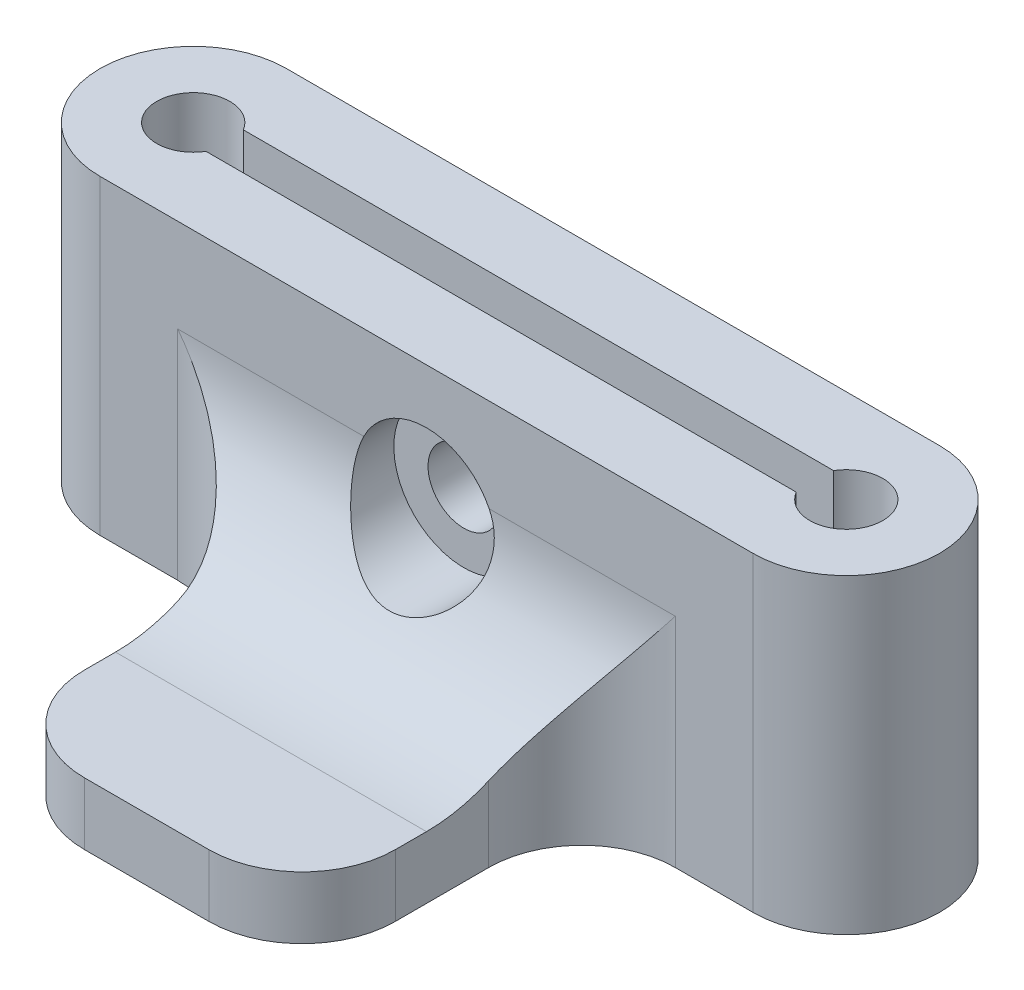
ISO-10303-21;
HEADER;
FILE_DESCRIPTION(('STEP AP214'),'2;1');
FILE_NAME('part.step','',(''),(''),'','','');
FILE_SCHEMA(('AUTOMOTIVE_DESIGN { 1 0 10303 214 1 1 1 1 }'));
ENDSEC;
DATA;
#1=APPLICATION_CONTEXT('core data for automotive mechanical design processes');
#2=APPLICATION_PROTOCOL_DEFINITION('international standard','automotive_design',2000,#1);
#3=PRODUCT_CONTEXT('',#1,'mechanical');
#4=PRODUCT('Part','Part','',(#3));
#5=PRODUCT_RELATED_PRODUCT_CATEGORY('part','',(#4));
#6=PRODUCT_DEFINITION_FORMATION('','',#4);
#7=PRODUCT_DEFINITION_CONTEXT('part definition',#1,'design');
#8=PRODUCT_DEFINITION('design','',#6,#7);
#9=PRODUCT_DEFINITION_SHAPE('','',#8);
#10=(LENGTH_UNIT() NAMED_UNIT(*) SI_UNIT(.MILLI.,.METRE.));
#11=(NAMED_UNIT(*) PLANE_ANGLE_UNIT() SI_UNIT($,.RADIAN.));
#12=(NAMED_UNIT(*) SI_UNIT($,.STERADIAN.) SOLID_ANGLE_UNIT());
#13=UNCERTAINTY_MEASURE_WITH_UNIT(LENGTH_MEASURE(1.E-05),#10,'distance_accuracy_value','');
#14=(GEOMETRIC_REPRESENTATION_CONTEXT(3) GLOBAL_UNCERTAINTY_ASSIGNED_CONTEXT((#13)) GLOBAL_UNIT_ASSIGNED_CONTEXT((#10,
#11,#12)) REPRESENTATION_CONTEXT('',''));
#15=CARTESIAN_POINT('',(0.,0.,0.));
#16=DIRECTION('',(0.,0.,1.));
#17=DIRECTION('',(1.,0.,0.));
#18=AXIS2_PLACEMENT_3D('',#15,#16,#17);
#19=CARTESIAN_POINT('',(0.,6.,-3.));
#20=DIRECTION('',(0.,0.,1.));
#21=DIRECTION('',(1.,0.,0.));
#22=AXIS2_PLACEMENT_3D('',#19,#20,#21);
#23=CYLINDRICAL_SURFACE('',#22,1.15);
#24=CARTESIAN_POINT('',(0.,6.,-0.6));
#25=DIRECTION('',(0.,0.,-1.));
#26=DIRECTION('',(-1.,0.,0.));
#27=AXIS2_PLACEMENT_3D('',#24,#25,#26);
#28=CIRCLE('',#27,1.15);
#29=CARTESIAN_POINT('',(-1.15,6.,-0.6));
#30=VERTEX_POINT('',#29);
#31=EDGE_CURVE('E263',#30,#30,#28,.T.);
#32=ORIENTED_EDGE('',*,*,#31,.F.);
#33=EDGE_LOOP('',(#32));
#34=FACE_BOUND('',#33,.T.);
#35=CARTESIAN_POINT('',(0.,6.,-1.5));
#36=DIRECTION('',(0.,0.,-1.));
#37=DIRECTION('',(-1.,0.,0.));
#38=AXIS2_PLACEMENT_3D('',#35,#36,#37);
#39=CIRCLE('',#38,1.15);
#40=CARTESIAN_POINT('',(-1.15,6.,-1.5));
#41=VERTEX_POINT('',#40);
#42=EDGE_CURVE('E44',#41,#41,#39,.F.);
#43=ORIENTED_EDGE('',*,*,#42,.F.);
#44=EDGE_LOOP('',(#43));
#45=FACE_BOUND('',#44,.T.);
#46=ADVANCED_FACE('F39',(#34,#45),#23,.F.);
#47=CARTESIAN_POINT('',(0.,7.,8.));
#48=DIRECTION('',(1.,0.,0.));
#49=DIRECTION('',(0.,0.,-1.));
#50=AXIS2_PLACEMENT_3D('',#47,#48,#49);
#51=CYLINDRICAL_SURFACE('',#50,5.);
#52=CARTESIAN_POINT('',(-2.01556443707464,7.,3.));
#53=CARTESIAN_POINT('',(-2.04175036487948,6.94723877501467,2.99999300896593));
#54=CARTESIAN_POINT('',(-2.06585073480588,6.89344078288716,3.00083496798393));
#55=CARTESIAN_POINT('',(-2.109745996837,6.78417417126407,3.00436298875684));
#56=CARTESIAN_POINT('',(-2.1295408156261,6.72870552333859,3.00704908191073));
#57=CARTESIAN_POINT('',(-2.16464542210361,6.61664371589301,3.01440230646445));
#58=CARTESIAN_POINT('',(-2.17996638703904,6.56005374260594,3.01906442828374));
#59=CARTESIAN_POINT('',(-2.20611600501055,6.4460681434285,3.03044783021604));
#60=CARTESIAN_POINT('',(-2.21694490592385,6.38867256217325,3.03716899667303));
#61=CARTESIAN_POINT('',(-2.24264423931978,6.21582810991499,3.06051329062134));
#62=CARTESIAN_POINT('',(-2.25073044685787,6.09971140376437,3.08031784448049));
#63=CARTESIAN_POINT('',(-2.24916345106013,5.86938691802106,3.12808175614079));
#64=CARTESIAN_POINT('',(-2.23950854097209,5.75517932315762,3.15604189831789));
#65=CARTESIAN_POINT('',(-2.20330128362021,5.52966744780162,3.21961675487502));
#66=CARTESIAN_POINT('',(-2.17647802356564,5.41844005746845,3.25534801669427));
#67=CARTESIAN_POINT('',(-2.10720173346062,5.20312323497078,3.3326295949892));
#68=CARTESIAN_POINT('',(-2.0647414242777,5.09903715393737,3.37418261593549));
#69=CARTESIAN_POINT('',(-1.96042439546428,4.88895331481458,3.46590946768372));
#70=CARTESIAN_POINT('',(-1.89697947371727,4.78394054653244,3.51653001272573));
#71=CARTESIAN_POINT('',(-1.75450332402742,4.58610252889114,3.61986468572548));
#72=CARTESIAN_POINT('',(-1.67545398528858,4.49329165181003,3.6725811889762));
#73=CARTESIAN_POINT('',(-1.49316365537025,4.31138982243017,3.7829004495677));
#74=CARTESIAN_POINT('',(-1.38818807487377,4.22394569484173,3.84037037042071));
#75=CARTESIAN_POINT('',(-1.16178647687953,4.06827465645595,3.94858514713366));
#76=CARTESIAN_POINT('',(-1.04038385361374,4.00002083408997,3.99933936732241));
#77=CARTESIAN_POINT('',(-0.818732140894734,3.90178255115438,4.07523449939828));
#78=CARTESIAN_POINT('',(-0.721958836539561,3.86643433798268,4.10357487065409));
#79=CARTESIAN_POINT('',(-0.522318848532056,3.80901098755309,4.15045791169847));
#80=CARTESIAN_POINT('',(-0.419461274598913,3.78691653228039,4.16901483654402));
#81=CARTESIAN_POINT('',(-0.209464273058739,3.75724988232855,4.19408703508113));
#82=CARTESIAN_POINT('',(-0.102301160703161,3.74977401624838,4.20052242427202));
#83=CARTESIAN_POINT('',(0.111969247602376,3.75023636948332,4.2001266156609));
#84=CARTESIAN_POINT('',(0.219076546107483,3.75817380707721,4.19329609067029));
#85=CARTESIAN_POINT('',(0.419590330432458,3.78736773012919,4.16864295591844));
#86=CARTESIAN_POINT('',(0.513336099698098,3.80729707031603,4.15191811710915));
#87=CARTESIAN_POINT('',(0.695858269669967,3.85820768835038,4.11024174275521));
#88=CARTESIAN_POINT('',(0.78463079545407,3.88919744912833,4.08528389391442));
#89=CARTESIAN_POINT('',(0.988138973411806,3.97455999036677,4.01871671282776));
#90=CARTESIAN_POINT('',(1.10013056457163,4.03334345609058,3.97437259876656));
#91=CARTESIAN_POINT('',(1.31091732161737,4.16707127503923,3.8791673889957));
#92=CARTESIAN_POINT('',(1.40969339748486,4.24203860643536,3.8282970693531));
#93=CARTESIAN_POINT('',(1.59427449664379,4.40741229380983,3.72352999409671));
#94=CARTESIAN_POINT('',(1.6798884743269,4.49801163912922,3.66960187211222));
#95=CARTESIAN_POINT('',(1.83532446629782,4.69249054414813,3.56291669066662));
#96=CARTESIAN_POINT('',(1.90514521906432,4.79637116368432,3.51015972505774));
#97=CARTESIAN_POINT('',(2.03341840310747,5.026963492781,3.40382861484484));
#98=CARTESIAN_POINT('',(2.09003243538265,5.1549197757315,3.35070161330166));
#99=CARTESIAN_POINT('',(2.17907744769574,5.42216037360604,3.25336204092652));
#100=CARTESIAN_POINT('',(2.21153056570779,5.56143418845957,3.2091413366759));
#101=CARTESIAN_POINT('',(2.24752413279597,5.83273526087939,3.13633360891));
#102=CARTESIAN_POINT('',(2.25359688946893,5.96412568215009,3.10663593014865));
#103=CARTESIAN_POINT('',(2.24230342081865,6.22791725385726,3.05815734328309));
#104=CARTESIAN_POINT('',(2.22495825661386,6.36031738975738,3.03936664760894));
#105=CARTESIAN_POINT('',(2.17625214454224,6.57840887217922,3.017018696461));
#106=CARTESIAN_POINT('',(2.15128327737051,6.66528823235687,3.01049475971174));
#107=CARTESIAN_POINT('',(2.09104857705997,6.83558498201691,3.00196938924199));
#108=CARTESIAN_POINT('',(2.05578791278093,6.91900408538639,2.99996568971695));
#109=CARTESIAN_POINT('',(2.01556443707464,7.,3.));
#110=B_SPLINE_CURVE_WITH_KNOTS('',3,(#52,#53,#54,#55,#56,#57,#58,#59,#60,#61,#62,#63,#64,#65,
#66,#67,#68,#69,#70,#71,#72,#73,#74,#75,#76,#77,#78,#79,#80,#81,#82,#83,#84,#85,#86,#87,#88,#89,
#90,#91,#92,#93,#94,#95,#96,#97,#98,#99,#100,#101,#102,#103,#104,#105,#106,#107,#108,#109),
.UNSPECIFIED.,.F.,.F.,(4,2,2,2,2,2,2,2,2,2,2,2,2,2,2,2,2,2,2,2,2,2,2,2,2,2,2,2,4),(0.,
0.176656014845354,0.353315037582458,0.529528852443758,0.705732942331843,1.05810966727465,
1.41052029375898,1.7686337707166,2.12691416262203,2.52349284280533,2.92053453534118,
3.36310295556381,3.80504760765345,4.1243800628563,4.44324593691299,4.76420597709031,
5.08514973946491,5.37581603946379,5.66670575044185,6.06665472641689,6.46717533704566,
6.8730500290664,7.27895712985139,7.7255087481676,8.17165069836637,8.57386197025033,
8.97571175065633,9.24688301158131,9.51791831554301),.UNSPECIFIED.);
#111=CARTESIAN_POINT('',(-2.01556443707464,7.,3.));
#112=VERTEX_POINT('',#111);
#113=CARTESIAN_POINT('',(2.01556443707464,7.,3.));
#114=VERTEX_POINT('',#113);
#115=EDGE_CURVE('E11',#112,#114,#110,.T.);
#116=ORIENTED_EDGE('',*,*,#115,.F.);
#117=DIRECTION('',(-1.,0.,0.));
#118=VECTOR('',#117,1.);
#119=CARTESIAN_POINT('',(8.,7.,3.));
#120=LINE('',#119,#118);
#121=CARTESIAN_POINT('',(-8.,7.,3.));
#122=VERTEX_POINT('',#121);
#123=EDGE_CURVE('E395',#122,#112,#120,.F.);
#124=ORIENTED_EDGE('',*,*,#123,.F.);
#125=CARTESIAN_POINT('',(-5.,2.41742430504416,6.));
#126=CARTESIAN_POINT('',(-4.99999007584464,2.45619433572678,5.91111111999838));
#127=CARTESIAN_POINT('',(-5.00394885534584,2.49756553159916,5.82342396283326));
#128=CARTESIAN_POINT('',(-5.01909527387802,2.58497092461,5.65122034191128));
#129=CARTESIAN_POINT('',(-5.03027108102269,2.63099738574333,5.56669892763463));
#130=CARTESIAN_POINT('',(-5.05900041117812,2.72681315065253,5.40214197951035));
#131=CARTESIAN_POINT('',(-5.07648778239047,2.77655933013035,5.32206950990217));
#132=CARTESIAN_POINT('',(-5.11717439439445,2.87977402986981,5.16583225064517));
#133=CARTESIAN_POINT('',(-5.14037657272062,2.93324445430396,5.08966949508105));
#134=CARTESIAN_POINT('',(-5.19855781113315,3.05784842466416,4.92217655542121));
#135=CARTESIAN_POINT('',(-5.23503000053934,3.12994713640746,4.83208183123254));
#136=CARTESIAN_POINT('',(-5.3148218834273,3.27855552023905,4.65875784631886));
#137=CARTESIAN_POINT('',(-5.35814656010761,3.35506837641437,4.57553364946836));
#138=CARTESIAN_POINT('',(-5.45077079658605,3.5121042298434,4.41570229294976));
#139=CARTESIAN_POINT('',(-5.50009596147953,3.59264348248163,4.3391260624048));
#140=CARTESIAN_POINT('',(-5.60362354169448,3.75677463200056,4.19295852675565));
#141=CARTESIAN_POINT('',(-5.65782452771141,3.84036563004706,4.12336518725023));
#142=CARTESIAN_POINT('',(-5.79274014298285,4.04392463557508,3.96462300080977));
#143=CARTESIAN_POINT('',(-5.87542029554435,4.1651272706597,3.87871762693229));
#144=CARTESIAN_POINT('',(-6.04705542389686,4.41143609639689,3.71971495392397));
#145=CARTESIAN_POINT('',(-6.13601288528326,4.53654382227043,3.64662276873677));
#146=CARTESIAN_POINT('',(-6.31881575359725,4.78979065819423,3.51274090730704));
#147=CARTESIAN_POINT('',(-6.41266284424727,4.91793080404362,3.45195550452723));
#148=CARTESIAN_POINT('',(-6.60404313592426,5.17643888357419,3.34228261146679));
#149=CARTESIAN_POINT('',(-6.70157575105494,5.30680646136517,3.29339323916332));
#150=CARTESIAN_POINT('',(-6.99243555246852,5.69263762108806,3.16650236970021));
#151=CARTESIAN_POINT('',(-7.18963215160328,5.95050185447785,3.10433245016192));
#152=CARTESIAN_POINT('',(-7.58839523182523,6.46860044004649,3.02142008987375));
#153=CARTESIAN_POINT('',(-7.78995197387807,6.72882888152756,3.00059336538387));
#154=CARTESIAN_POINT('',(-7.99422653603195,6.99254648939595,3.00000417362007));
#155=CARTESIAN_POINT('',(-7.99711328912766,6.99627327159152,3.00000000728194));
#156=CARTESIAN_POINT('',(-8.,7.,3.));
#157=B_SPLINE_CURVE_WITH_KNOTS('',3,(#125,#126,#127,#128,#129,#130,#131,#132,#133,#134,#135,
#136,#137,#138,#139,#140,#141,#142,#143,#144,#145,#146,#147,#148,#149,#150,#151,#152,#153,#154,
#155,#156),.UNSPECIFIED.,.F.,.F.,(4,2,2,2,2,2,2,2,2,2,2,2,2,2,2,4),(0.,0.290715926078942,
0.580956446582299,0.868239309782229,1.15567015190112,1.51818907481711,1.88097284765797,
2.24536288350869,2.60964644752272,3.11894232553603,3.62844101097633,4.13811631474606,
4.64771093234505,5.63631090330859,6.62289340018379,6.63703554133181),.UNSPECIFIED.);
#158=CARTESIAN_POINT('',(-5.,2.41742430504416,6.));
#159=VERTEX_POINT('',#158);
#160=EDGE_CURVE('E401',#159,#122,#157,.T.);
#161=ORIENTED_EDGE('',*,*,#160,.F.);
#162=CARTESIAN_POINT('',(-5.,7.,8.));
#163=DIRECTION('',(-1.,0.,0.));
#164=DIRECTION('',(0.,0.,1.));
#165=AXIS2_PLACEMENT_3D('',#162,#163,#164);
#166=CIRCLE('',#165,5.);
#167=CARTESIAN_POINT('',(-5.,2.,8.));
#168=VERTEX_POINT('',#167);
#169=EDGE_CURVE('E398',#168,#159,#166,.F.);
#170=ORIENTED_EDGE('',*,*,#169,.F.);
#171=DIRECTION('',(-1.,0.,0.));
#172=VECTOR('',#171,1.);
#173=CARTESIAN_POINT('',(-8.,2.,8.));
#174=LINE('',#173,#172);
#175=CARTESIAN_POINT('',(5.,2.,8.));
#176=VERTEX_POINT('',#175);
#177=EDGE_CURVE('E391',#176,#168,#174,.T.);
#178=ORIENTED_EDGE('',*,*,#177,.F.);
#179=CARTESIAN_POINT('',(5.,7.,8.));
#180=DIRECTION('',(1.,0.,0.));
#181=DIRECTION('',(0.,0.,-1.));
#182=AXIS2_PLACEMENT_3D('',#179,#180,#181);
#183=CIRCLE('',#182,5.);
#184=CARTESIAN_POINT('',(5.,2.41742430504416,6.));
#185=VERTEX_POINT('',#184);
#186=EDGE_CURVE('E49',#185,#176,#183,.F.);
#187=ORIENTED_EDGE('',*,*,#186,.F.);
#188=CARTESIAN_POINT('',(5.,2.41742430504416,6.));
#189=CARTESIAN_POINT('',(4.99999007584464,2.45619433572678,5.91111111999838));
#190=CARTESIAN_POINT('',(5.00394885534584,2.49756553159916,5.82342396283326));
#191=CARTESIAN_POINT('',(5.01909527387802,2.58497092461,5.65122034191128));
#192=CARTESIAN_POINT('',(5.03027108102269,2.63099738574334,5.56669892763463));
#193=CARTESIAN_POINT('',(5.05900041117812,2.72681315065253,5.40214197951034));
#194=CARTESIAN_POINT('',(5.07648778239047,2.77655933013035,5.32206950990216));
#195=CARTESIAN_POINT('',(5.11717439439445,2.87977402986981,5.16583225064517));
#196=CARTESIAN_POINT('',(5.14037657272062,2.93324445430396,5.08966949508105));
#197=CARTESIAN_POINT('',(5.19855781113315,3.05784842466416,4.92217655542121));
#198=CARTESIAN_POINT('',(5.23503000053933,3.12994713640746,4.83208183123254));
#199=CARTESIAN_POINT('',(5.3148218834273,3.27855552023905,4.65875784631886));
#200=CARTESIAN_POINT('',(5.35814656010761,3.35506837641436,4.57553364946836));
#201=CARTESIAN_POINT('',(5.45077079658604,3.5121042298434,4.41570229294976));
#202=CARTESIAN_POINT('',(5.50009596147953,3.59264348248163,4.3391260624048));
#203=CARTESIAN_POINT('',(5.60362354169447,3.75677463200057,4.19295852675565));
#204=CARTESIAN_POINT('',(5.65782452771141,3.84036563004706,4.12336518725023));
#205=CARTESIAN_POINT('',(5.79274014298285,4.04392463557509,3.96462300080977));
#206=CARTESIAN_POINT('',(5.87542029554435,4.1651272706597,3.87871762693229));
#207=CARTESIAN_POINT('',(6.04705542389686,4.4114360963969,3.71971495392396));
#208=CARTESIAN_POINT('',(6.13601288528326,4.53654382227044,3.64662276873677));
#209=CARTESIAN_POINT('',(6.31881575359725,4.78979065819424,3.51274090730704));
#210=CARTESIAN_POINT('',(6.41266284424727,4.91793080404363,3.45195550452723));
#211=CARTESIAN_POINT('',(6.60404313592427,5.17643888357419,3.34228261146679));
#212=CARTESIAN_POINT('',(6.70157575105496,5.30680646136516,3.29339323916331));
#213=CARTESIAN_POINT('',(6.99243555246849,5.69263762108809,3.16650236970021));
#214=CARTESIAN_POINT('',(7.18963215160311,5.95050185447798,3.10433245016192));
#215=CARTESIAN_POINT('',(7.58839523182539,6.46860044004637,3.02142008987375));
#216=CARTESIAN_POINT('',(7.78995197387871,6.72882888152706,3.00059336538387));
#217=CARTESIAN_POINT('',(7.99422653603197,6.99254648939593,3.00000417362007));
#218=CARTESIAN_POINT('',(7.99711328912767,6.99627327159151,3.00000000728194));
#219=CARTESIAN_POINT('',(8.,7.,3.));
#220=B_SPLINE_CURVE_WITH_KNOTS('',3,(#188,#189,#190,#191,#192,#193,#194,#195,#196,#197,#198,
#199,#200,#201,#202,#203,#204,#205,#206,#207,#208,#209,#210,#211,#212,#213,#214,#215,#216,#217,
#218,#219),.UNSPECIFIED.,.F.,.F.,(4,2,2,2,2,2,2,2,2,2,2,2,2,2,2,4),(0.,0.290715926078945,
0.580956446582304,0.868239309782232,1.15567015190112,1.51818907481711,1.88097284765797,
2.24536288350869,2.60964644752272,3.11894232553604,3.62844101097634,4.13811631474607,
4.64771093234505,5.63631090330859,6.62289340018379,6.63703554133181),.UNSPECIFIED.);
#221=CARTESIAN_POINT('',(8.,7.,3.));
#222=VERTEX_POINT('',#221);
#223=EDGE_CURVE('E408',#222,#185,#220,.F.);
#224=ORIENTED_EDGE('',*,*,#223,.F.);
#225=EDGE_CURVE('E394',#114,#222,#120,.F.);
#226=ORIENTED_EDGE('',*,*,#225,.F.);
#227=EDGE_LOOP('',(#116,#124,#161,#170,#178,#187,#224,#226));
#228=FACE_BOUND('',#227,.T.);
#229=ADVANCED_FACE('F41',(#228),#51,.F.);
#230=CARTESIAN_POINT('',(-10.5,10.,0.));
#231=DIRECTION('',(0.,1.,0.));
#232=DIRECTION('',(0.,0.,1.));
#233=AXIS2_PLACEMENT_3D('',#230,#231,#232);
#234=PLANE('',#233);
#235=DIRECTION('',(1.,0.,0.));
#236=VECTOR('',#235,1.);
#237=CARTESIAN_POINT('',(-9.48974013244117,10.,-0.6));
#238=LINE('',#237,#236);
#239=CARTESIAN_POINT('',(-9.48974013244117,10.,-0.600000000000008));
#240=VERTEX_POINT('',#239);
#241=CARTESIAN_POINT('',(9.48974013244116,10.,-0.6));
#242=VERTEX_POINT('',#241);
#243=EDGE_CURVE('E275',#240,#242,#238,.T.);
#244=ORIENTED_EDGE('',*,*,#243,.T.);
#245=CARTESIAN_POINT('',(10.5,10.,0.));
#246=DIRECTION('',(0.,1.,0.));
#247=DIRECTION('',(0.,0.,1.));
#248=AXIS2_PLACEMENT_3D('',#245,#246,#247);
#249=CIRCLE('',#248,1.175);
#250=CARTESIAN_POINT('',(9.48974013244116,10.,0.6));
#251=VERTEX_POINT('',#250);
#252=EDGE_CURVE('E318',#251,#242,#249,.T.);
#253=ORIENTED_EDGE('',*,*,#252,.F.);
#254=DIRECTION('',(-1.,0.,0.));
#255=VECTOR('',#254,1.);
#256=CARTESIAN_POINT('',(-9.48974013244117,10.,0.6));
#257=LINE('',#256,#255);
#258=CARTESIAN_POINT('',(-9.48974013244117,10.,0.6));
#259=VERTEX_POINT('',#258);
#260=EDGE_CURVE('E272',#251,#259,#257,.T.);
#261=ORIENTED_EDGE('',*,*,#260,.T.);
#262=CARTESIAN_POINT('',(-10.5,10.,0.));
#263=DIRECTION('',(0.,1.,0.));
#264=DIRECTION('',(0.,0.,-1.));
#265=AXIS2_PLACEMENT_3D('',#262,#263,#264);
#266=CIRCLE('',#265,1.175);
#267=EDGE_CURVE('E312',#240,#259,#266,.T.);
#268=ORIENTED_EDGE('',*,*,#267,.F.);
#269=EDGE_LOOP('',(#244,#253,#261,#268));
#270=FACE_BOUND('',#269,.T.);
#271=CARTESIAN_POINT('',(-10.5,10.,0.));
#272=DIRECTION('',(0.,1.,0.));
#273=DIRECTION('',(0.,0.,1.));
#274=AXIS2_PLACEMENT_3D('',#271,#272,#273);
#275=CIRCLE('',#274,3.);
#276=CARTESIAN_POINT('',(-10.5,10.,-3.));
#277=VERTEX_POINT('',#276);
#278=CARTESIAN_POINT('',(-10.5,10.,3.));
#279=VERTEX_POINT('',#278);
#280=EDGE_CURVE('E324',#277,#279,#275,.T.);
#281=ORIENTED_EDGE('',*,*,#280,.T.);
#282=DIRECTION('',(1.,0.,0.));
#283=VECTOR('',#282,1.);
#284=CARTESIAN_POINT('',(-10.5,10.,3.));
#285=LINE('',#284,#283);
#286=CARTESIAN_POINT('',(10.5,10.,3.));
#287=VERTEX_POINT('',#286);
#288=EDGE_CURVE('E327',#279,#287,#285,.T.);
#289=ORIENTED_EDGE('',*,*,#288,.T.);
#290=CARTESIAN_POINT('',(10.5,10.,0.));
#291=DIRECTION('',(0.,1.,0.));
#292=DIRECTION('',(0.,0.,1.));
#293=AXIS2_PLACEMENT_3D('',#290,#291,#292);
#294=CIRCLE('',#293,3.);
#295=CARTESIAN_POINT('',(10.5,10.,-3.));
#296=VERTEX_POINT('',#295);
#297=EDGE_CURVE('E330',#287,#296,#294,.T.);
#298=ORIENTED_EDGE('',*,*,#297,.T.);
#299=DIRECTION('',(-1.,0.,0.));
#300=VECTOR('',#299,1.);
#301=CARTESIAN_POINT('',(-10.5,10.,-3.));
#302=LINE('',#301,#300);
#303=EDGE_CURVE('E332',#296,#277,#302,.T.);
#304=ORIENTED_EDGE('',*,*,#303,.T.);
#305=EDGE_LOOP('',(#281,#289,#298,#304));
#306=FACE_BOUND('',#305,.T.);
#307=ADVANCED_FACE('F454',(#270,#306),#234,.T.);
#308=CARTESIAN_POINT('',(-10.5,0.,0.));
#309=DIRECTION('',(0.,1.,0.));
#310=DIRECTION('',(0.,0.,1.));
#311=AXIS2_PLACEMENT_3D('',#308,#309,#310);
#312=PLANE('',#311);
#313=DIRECTION('',(-1.,0.,0.));
#314=VECTOR('',#313,1.);
#315=CARTESIAN_POINT('',(-5.,0.,12.));
#316=LINE('',#315,#314);
#317=CARTESIAN_POINT('',(2.,0.,12.));
#318=VERTEX_POINT('',#317);
#319=CARTESIAN_POINT('',(-2.,0.,12.));
#320=VERTEX_POINT('',#319);
#321=EDGE_CURVE('E305',#318,#320,#316,.T.);
#322=ORIENTED_EDGE('',*,*,#321,.T.);
#323=CARTESIAN_POINT('',(-2.,0.,9.));
#324=DIRECTION('',(0.,1.,0.));
#325=DIRECTION('',(0.,0.,1.));
#326=AXIS2_PLACEMENT_3D('',#323,#324,#325);
#327=CIRCLE('',#326,3.);
#328=CARTESIAN_POINT('',(-5.,0.,9.));
#329=VERTEX_POINT('',#328);
#330=EDGE_CURVE('E363',#320,#329,#327,.F.);
#331=ORIENTED_EDGE('',*,*,#330,.T.);
#332=DIRECTION('',(0.,0.,-1.));
#333=VECTOR('',#332,1.);
#334=CARTESIAN_POINT('',(-5.,0.,12.));
#335=LINE('',#334,#333);
#336=CARTESIAN_POINT('',(-5.,0.,6.));
#337=VERTEX_POINT('',#336);
#338=EDGE_CURVE('E295',#329,#337,#335,.T.);
#339=ORIENTED_EDGE('',*,*,#338,.T.);
#340=CARTESIAN_POINT('',(-8.,0.,6.));
#341=DIRECTION('',(0.,1.,0.));
#342=DIRECTION('',(0.,0.,1.));
#343=AXIS2_PLACEMENT_3D('',#340,#341,#342);
#344=CIRCLE('',#343,3.);
#345=CARTESIAN_POINT('',(-8.,0.,3.));
#346=VERTEX_POINT('',#345);
#347=EDGE_CURVE('E389',#337,#346,#344,.T.);
#348=ORIENTED_EDGE('',*,*,#347,.T.);
#349=DIRECTION('',(1.,0.,0.));
#350=VECTOR('',#349,1.);
#351=CARTESIAN_POINT('',(-10.5,0.,3.));
#352=LINE('',#351,#350);
#353=CARTESIAN_POINT('',(-10.5,0.,3.));
#354=VERTEX_POINT('',#353);
#355=EDGE_CURVE('E338',#354,#346,#352,.T.);
#356=ORIENTED_EDGE('',*,*,#355,.F.);
#357=CARTESIAN_POINT('',(-10.5,0.,0.));
#358=DIRECTION('',(0.,1.,0.));
#359=DIRECTION('',(0.,0.,1.));
#360=AXIS2_PLACEMENT_3D('',#357,#358,#359);
#361=CIRCLE('',#360,3.);
#362=CARTESIAN_POINT('',(-10.5,0.,-3.));
#363=VERTEX_POINT('',#362);
#364=EDGE_CURVE('E321',#363,#354,#361,.T.);
#365=ORIENTED_EDGE('',*,*,#364,.F.);
#366=DIRECTION('',(-1.,0.,0.));
#367=VECTOR('',#366,1.);
#368=CARTESIAN_POINT('',(-10.5,0.,-3.));
#369=LINE('',#368,#367);
#370=CARTESIAN_POINT('',(10.5,0.,-3.));
#371=VERTEX_POINT('',#370);
#372=EDGE_CURVE('E328',#371,#363,#369,.T.);
#373=ORIENTED_EDGE('',*,*,#372,.F.);
#374=CARTESIAN_POINT('',(10.5,0.,0.));
#375=DIRECTION('',(0.,1.,0.));
#376=DIRECTION('',(0.,0.,1.));
#377=AXIS2_PLACEMENT_3D('',#374,#375,#376);
#378=CIRCLE('',#377,3.);
#379=CARTESIAN_POINT('',(10.5,0.,3.));
#380=VERTEX_POINT('',#379);
#381=EDGE_CURVE('E341',#380,#371,#378,.T.);
#382=ORIENTED_EDGE('',*,*,#381,.F.);
#383=CARTESIAN_POINT('',(7.99999999999999,0.,3.));
#384=VERTEX_POINT('',#383);
#385=EDGE_CURVE('E337',#384,#380,#352,.T.);
#386=ORIENTED_EDGE('',*,*,#385,.F.);
#387=CARTESIAN_POINT('',(8.,0.,6.));
#388=DIRECTION('',(0.,1.,0.));
#389=DIRECTION('',(0.,0.,1.));
#390=AXIS2_PLACEMENT_3D('',#387,#388,#389);
#391=CIRCLE('',#390,3.);
#392=CARTESIAN_POINT('',(5.,0.,6.));
#393=VERTEX_POINT('',#392);
#394=EDGE_CURVE('E387',#384,#393,#391,.T.);
#395=ORIENTED_EDGE('',*,*,#394,.T.);
#396=DIRECTION('',(0.,0.,1.));
#397=VECTOR('',#396,1.);
#398=CARTESIAN_POINT('',(5.,0.,12.));
#399=LINE('',#398,#397);
#400=CARTESIAN_POINT('',(5.,0.,9.));
#401=VERTEX_POINT('',#400);
#402=EDGE_CURVE('E285',#393,#401,#399,.T.);
#403=ORIENTED_EDGE('',*,*,#402,.T.);
#404=CARTESIAN_POINT('',(2.,0.,9.));
#405=DIRECTION('',(0.,1.,0.));
#406=DIRECTION('',(0.,0.,1.));
#407=AXIS2_PLACEMENT_3D('',#404,#405,#406);
#408=CIRCLE('',#407,3.);
#409=EDGE_CURVE('E361',#401,#318,#408,.F.);
#410=ORIENTED_EDGE('',*,*,#409,.T.);
#411=EDGE_LOOP('',(#322,#331,#339,#348,#356,#365,#373,#382,#386,#395,#403,#410));
#412=FACE_BOUND('',#411,.T.);
#413=CARTESIAN_POINT('',(10.5,0.,0.));
#414=DIRECTION('',(0.,1.,0.));
#415=DIRECTION('',(0.,0.,1.));
#416=AXIS2_PLACEMENT_3D('',#413,#414,#415);
#417=CIRCLE('',#416,1.175);
#418=CARTESIAN_POINT('',(9.48974013244116,0.,0.6));
#419=VERTEX_POINT('',#418);
#420=CARTESIAN_POINT('',(9.48974013244116,0.,-0.6));
#421=VERTEX_POINT('',#420);
#422=EDGE_CURVE('E315',#419,#421,#417,.T.);
#423=ORIENTED_EDGE('',*,*,#422,.T.);
#424=DIRECTION('',(1.,0.,0.));
#425=VECTOR('',#424,1.);
#426=CARTESIAN_POINT('',(-9.48974013244117,0.,-0.6));
#427=LINE('',#426,#425);
#428=CARTESIAN_POINT('',(-9.48974013244117,0.,-0.6));
#429=VERTEX_POINT('',#428);
#430=EDGE_CURVE('E276',#429,#421,#427,.T.);
#431=ORIENTED_EDGE('',*,*,#430,.F.);
#432=CARTESIAN_POINT('',(-10.5,0.,0.));
#433=DIRECTION('',(0.,1.,0.));
#434=DIRECTION('',(0.,0.,-1.));
#435=AXIS2_PLACEMENT_3D('',#432,#433,#434);
#436=CIRCLE('',#435,1.175);
#437=CARTESIAN_POINT('',(-9.48974013244117,0.,0.600000000000008));
#438=VERTEX_POINT('',#437);
#439=EDGE_CURVE('E302',#429,#438,#436,.T.);
#440=ORIENTED_EDGE('',*,*,#439,.T.);
#441=DIRECTION('',(-1.,0.,0.));
#442=VECTOR('',#441,1.);
#443=CARTESIAN_POINT('',(-9.48974013244117,0.,0.6));
#444=LINE('',#443,#442);
#445=EDGE_CURVE('E271',#419,#438,#444,.T.);
#446=ORIENTED_EDGE('',*,*,#445,.F.);
#447=EDGE_LOOP('',(#423,#431,#440,#446));
#448=FACE_BOUND('',#447,.T.);
#449=ADVANCED_FACE('F438',(#412,#448),#312,.F.);
#450=CARTESIAN_POINT('',(-10.5,10.,0.));
#451=DIRECTION('',(0.,-1.,0.));
#452=DIRECTION('',(0.,0.,-1.));
#453=AXIS2_PLACEMENT_3D('',#450,#451,#452);
#454=CYLINDRICAL_SURFACE('',#453,3.);
#455=ORIENTED_EDGE('',*,*,#364,.T.);
#456=DIRECTION('',(0.,-1.,0.));
#457=VECTOR('',#456,1.);
#458=CARTESIAN_POINT('',(-10.5,10.,3.));
#459=LINE('',#458,#457);
#460=EDGE_CURVE('E352',#279,#354,#459,.T.);
#461=ORIENTED_EDGE('',*,*,#460,.F.);
#462=ORIENTED_EDGE('',*,*,#280,.F.);
#463=DIRECTION('',(0.,-1.,0.));
#464=VECTOR('',#463,1.);
#465=CARTESIAN_POINT('',(-10.5,10.,-3.));
#466=LINE('',#465,#464);
#467=EDGE_CURVE('E334',#277,#363,#466,.T.);
#468=ORIENTED_EDGE('',*,*,#467,.T.);
#469=EDGE_LOOP('',(#455,#461,#462,#468));
#470=FACE_BOUND('',#469,.T.);
#471=ADVANCED_FACE('F434',(#470),#454,.T.);
#472=CARTESIAN_POINT('',(-10.5,10.,3.));
#473=DIRECTION('',(0.,0.,-1.));
#474=DIRECTION('',(-1.,0.,0.));
#475=AXIS2_PLACEMENT_3D('',#472,#473,#474);
#476=PLANE('',#475);
#477=CARTESIAN_POINT('',(0.,6.,3.));
#478=DIRECTION('',(0.,0.,-1.));
#479=DIRECTION('',(-1.,0.,0.));
#480=AXIS2_PLACEMENT_3D('',#477,#478,#479);
#481=CIRCLE('',#480,2.25);
#482=EDGE_CURVE('E63',#114,#112,#481,.F.);
#483=ORIENTED_EDGE('',*,*,#482,.F.);
#484=ORIENTED_EDGE('',*,*,#225,.T.);
#485=DIRECTION('',(0.,-1.,0.));
#486=VECTOR('',#485,1.);
#487=CARTESIAN_POINT('',(8.,10.,3.));
#488=LINE('',#487,#486);
#489=EDGE_CURVE('E384',#222,#384,#488,.T.);
#490=ORIENTED_EDGE('',*,*,#489,.T.);
#491=ORIENTED_EDGE('',*,*,#385,.T.);
#492=DIRECTION('',(0.,-1.,0.));
#493=VECTOR('',#492,1.);
#494=CARTESIAN_POINT('',(10.5,10.,3.));
#495=LINE('',#494,#493);
#496=EDGE_CURVE('E349',#287,#380,#495,.T.);
#497=ORIENTED_EDGE('',*,*,#496,.F.);
#498=ORIENTED_EDGE('',*,*,#288,.F.);
#499=ORIENTED_EDGE('',*,*,#460,.T.);
#500=ORIENTED_EDGE('',*,*,#355,.T.);
#501=DIRECTION('',(0.,1.,0.));
#502=VECTOR('',#501,1.);
#503=CARTESIAN_POINT('',(-8.,10.,3.));
#504=LINE('',#503,#502);
#505=EDGE_CURVE('E382',#346,#122,#504,.T.);
#506=ORIENTED_EDGE('',*,*,#505,.T.);
#507=ORIENTED_EDGE('',*,*,#123,.T.);
#508=EDGE_LOOP('',(#483,#484,#490,#491,#497,#498,#499,#500,#506,#507));
#509=FACE_BOUND('',#508,.T.);
#510=ADVANCED_FACE('F437',(#509),#476,.F.);
#511=CARTESIAN_POINT('',(10.5,10.,0.));
#512=DIRECTION('',(0.,-1.,0.));
#513=DIRECTION('',(0.,0.,-1.));
#514=AXIS2_PLACEMENT_3D('',#511,#512,#513);
#515=CYLINDRICAL_SURFACE('',#514,3.);
#516=ORIENTED_EDGE('',*,*,#381,.T.);
#517=DIRECTION('',(0.,-1.,0.));
#518=VECTOR('',#517,1.);
#519=CARTESIAN_POINT('',(10.5,10.,-3.));
#520=LINE('',#519,#518);
#521=EDGE_CURVE('E346',#296,#371,#520,.T.);
#522=ORIENTED_EDGE('',*,*,#521,.F.);
#523=ORIENTED_EDGE('',*,*,#297,.F.);
#524=ORIENTED_EDGE('',*,*,#496,.T.);
#525=EDGE_LOOP('',(#516,#522,#523,#524));
#526=FACE_BOUND('',#525,.T.);
#527=ADVANCED_FACE('F442',(#526),#515,.T.);
#528=CARTESIAN_POINT('',(-10.5,10.,-3.));
#529=DIRECTION('',(0.,0.,1.));
#530=DIRECTION('',(1.,0.,0.));
#531=AXIS2_PLACEMENT_3D('',#528,#529,#530);
#532=PLANE('',#531);
#533=DIRECTION('',(0.866025403784438,-0.5,0.));
#534=VECTOR('',#533,1.);
#535=CARTESIAN_POINT('',(0.,8.42487113059643,-3.));
#536=LINE('',#535,#534);
#537=CARTESIAN_POINT('',(0.,8.42487113059643,-3.));
#538=VERTEX_POINT('',#537);
#539=CARTESIAN_POINT('',(2.1,7.21243556529821,-3.));
#540=VERTEX_POINT('',#539);
#541=EDGE_CURVE('E241',#538,#540,#536,.T.);
#542=ORIENTED_EDGE('',*,*,#541,.F.);
#543=DIRECTION('',(0.866025403784439,0.499999999999999,0.));
#544=VECTOR('',#543,1.);
#545=CARTESIAN_POINT('',(-2.1,7.21243556529822,-3.));
#546=LINE('',#545,#544);
#547=CARTESIAN_POINT('',(-2.1,7.21243556529822,-3.));
#548=VERTEX_POINT('',#547);
#549=EDGE_CURVE('E57',#548,#538,#546,.T.);
#550=ORIENTED_EDGE('',*,*,#549,.F.);
#551=DIRECTION('',(0.,1.,0.));
#552=VECTOR('',#551,1.);
#553=CARTESIAN_POINT('',(-2.1,4.78756443470179,-3.));
#554=LINE('',#553,#552);
#555=CARTESIAN_POINT('',(-2.1,4.78756443470179,-3.));
#556=VERTEX_POINT('',#555);
#557=EDGE_CURVE('E227',#556,#548,#554,.T.);
#558=ORIENTED_EDGE('',*,*,#557,.F.);
#559=DIRECTION('',(-0.866025403784438,0.5,0.));
#560=VECTOR('',#559,1.);
#561=CARTESIAN_POINT('',(0.,3.57512886940357,-3.));
#562=LINE('',#561,#560);
#563=CARTESIAN_POINT('',(0.,3.57512886940357,-3.));
#564=VERTEX_POINT('',#563);
#565=EDGE_CURVE('E230',#564,#556,#562,.T.);
#566=ORIENTED_EDGE('',*,*,#565,.F.);
#567=DIRECTION('',(-0.866025403784439,-0.499999999999999,0.));
#568=VECTOR('',#567,1.);
#569=CARTESIAN_POINT('',(2.1,4.78756443470178,-3.));
#570=LINE('',#569,#568);
#571=CARTESIAN_POINT('',(2.1,4.78756443470178,-3.));
#572=VERTEX_POINT('',#571);
#573=EDGE_CURVE('E246',#572,#564,#570,.T.);
#574=ORIENTED_EDGE('',*,*,#573,.F.);
#575=DIRECTION('',(0.,-1.,0.));
#576=VECTOR('',#575,1.);
#577=CARTESIAN_POINT('',(2.1,7.21243556529821,-3.));
#578=LINE('',#577,#576);
#579=EDGE_CURVE('E243',#540,#572,#578,.T.);
#580=ORIENTED_EDGE('',*,*,#579,.F.);
#581=EDGE_LOOP('',(#542,#550,#558,#566,#574,#580));
#582=FACE_BOUND('',#581,.T.);
#583=ORIENTED_EDGE('',*,*,#372,.T.);
#584=ORIENTED_EDGE('',*,*,#467,.F.);
#585=ORIENTED_EDGE('',*,*,#303,.F.);
#586=ORIENTED_EDGE('',*,*,#521,.T.);
#587=EDGE_LOOP('',(#583,#584,#585,#586));
#588=FACE_BOUND('',#587,.T.);
#589=ADVANCED_FACE('F446',(#582,#588),#532,.F.);
#590=CARTESIAN_POINT('',(10.5,10.,0.));
#591=DIRECTION('',(0.,-1.,0.));
#592=DIRECTION('',(0.,0.,-1.));
#593=AXIS2_PLACEMENT_3D('',#590,#591,#592);
#594=CYLINDRICAL_SURFACE('',#593,1.175);
#595=DIRECTION('',(0.,-1.,0.));
#596=VECTOR('',#595,1.);
#597=CARTESIAN_POINT('',(9.48974013244116,10.,-0.6));
#598=LINE('',#597,#596);
#599=EDGE_CURVE('E282',#242,#421,#598,.T.);
#600=ORIENTED_EDGE('',*,*,#599,.T.);
#601=ORIENTED_EDGE('',*,*,#422,.F.);
#602=DIRECTION('',(0.,-1.,0.));
#603=VECTOR('',#602,1.);
#604=CARTESIAN_POINT('',(9.48974013244116,10.,0.6));
#605=LINE('',#604,#603);
#606=EDGE_CURVE('E279',#251,#419,#605,.T.);
#607=ORIENTED_EDGE('',*,*,#606,.F.);
#608=ORIENTED_EDGE('',*,*,#252,.T.);
#609=EDGE_LOOP('',(#600,#601,#607,#608));
#610=FACE_BOUND('',#609,.T.);
#611=ADVANCED_FACE('F450',(#610),#594,.F.);
#612=CARTESIAN_POINT('',(-10.5,10.,0.));
#613=DIRECTION('',(0.,-1.,0.));
#614=DIRECTION('',(0.,0.,-1.));
#615=AXIS2_PLACEMENT_3D('',#612,#613,#614);
#616=CYLINDRICAL_SURFACE('',#615,1.175);
#617=DIRECTION('',(0.,-1.,0.));
#618=VECTOR('',#617,1.);
#619=CARTESIAN_POINT('',(-9.48974013244117,10.,-0.6));
#620=LINE('',#619,#618);
#621=EDGE_CURVE('E286',#240,#429,#620,.T.);
#622=ORIENTED_EDGE('',*,*,#621,.F.);
#623=ORIENTED_EDGE('',*,*,#267,.T.);
#624=DIRECTION('',(0.,-1.,0.));
#625=VECTOR('',#624,1.);
#626=CARTESIAN_POINT('',(-9.48974013244117,10.,0.6));
#627=LINE('',#626,#625);
#628=EDGE_CURVE('E288',#259,#438,#627,.T.);
#629=ORIENTED_EDGE('',*,*,#628,.T.);
#630=ORIENTED_EDGE('',*,*,#439,.F.);
#631=EDGE_LOOP('',(#622,#623,#629,#630));
#632=FACE_BOUND('',#631,.T.);
#633=ADVANCED_FACE('F461',(#632),#616,.F.);
#634=CARTESIAN_POINT('',(5.,2.,12.));
#635=DIRECTION('',(1.,0.,0.));
#636=DIRECTION('',(0.,0.,-1.));
#637=AXIS2_PLACEMENT_3D('',#634,#635,#636);
#638=PLANE('',#637);
#639=DIRECTION('',(0.,-1.,0.));
#640=VECTOR('',#639,1.);
#641=CARTESIAN_POINT('',(5.,2.,6.));
#642=LINE('',#641,#640);
#643=EDGE_CURVE('E377',#393,#185,#642,.F.);
#644=ORIENTED_EDGE('',*,*,#643,.T.);
#645=ORIENTED_EDGE('',*,*,#186,.T.);
#646=DIRECTION('',(0.,0.,1.));
#647=VECTOR('',#646,1.);
#648=CARTESIAN_POINT('',(5.,2.,12.));
#649=LINE('',#648,#647);
#650=CARTESIAN_POINT('',(5.,2.,9.));
#651=VERTEX_POINT('',#650);
#652=EDGE_CURVE('E292',#176,#651,#649,.T.);
#653=ORIENTED_EDGE('',*,*,#652,.T.);
#654=DIRECTION('',(0.,-1.,0.));
#655=VECTOR('',#654,1.);
#656=CARTESIAN_POINT('',(5.,2.,9.));
#657=LINE('',#656,#655);
#658=EDGE_CURVE('E379',#651,#401,#657,.T.);
#659=ORIENTED_EDGE('',*,*,#658,.T.);
#660=ORIENTED_EDGE('',*,*,#402,.F.);
#661=EDGE_LOOP('',(#644,#645,#653,#659,#660));
#662=FACE_BOUND('',#661,.T.);
#663=ADVANCED_FACE('F465',(#662),#638,.T.);
#664=CARTESIAN_POINT('',(-5.,2.,12.));
#665=DIRECTION('',(-1.,0.,0.));
#666=DIRECTION('',(0.,0.,1.));
#667=AXIS2_PLACEMENT_3D('',#664,#665,#666);
#668=PLANE('',#667);
#669=ORIENTED_EDGE('',*,*,#338,.F.);
#670=DIRECTION('',(0.,-1.,0.));
#671=VECTOR('',#670,1.);
#672=CARTESIAN_POINT('',(-5.,2.,9.));
#673=LINE('',#672,#671);
#674=CARTESIAN_POINT('',(-5.,2.,9.));
#675=VERTEX_POINT('',#674);
#676=EDGE_CURVE('E368',#329,#675,#673,.F.);
#677=ORIENTED_EDGE('',*,*,#676,.T.);
#678=DIRECTION('',(0.,0.,-1.));
#679=VECTOR('',#678,1.);
#680=CARTESIAN_POINT('',(-5.,2.,12.));
#681=LINE('',#680,#679);
#682=EDGE_CURVE('E299',#675,#168,#681,.T.);
#683=ORIENTED_EDGE('',*,*,#682,.T.);
#684=ORIENTED_EDGE('',*,*,#169,.T.);
#685=DIRECTION('',(0.,1.,0.));
#686=VECTOR('',#685,1.);
#687=CARTESIAN_POINT('',(-5.,2.,6.));
#688=LINE('',#687,#686);
#689=EDGE_CURVE('E366',#159,#337,#688,.F.);
#690=ORIENTED_EDGE('',*,*,#689,.T.);
#691=EDGE_LOOP('',(#669,#677,#683,#684,#690));
#692=FACE_BOUND('',#691,.T.);
#693=ADVANCED_FACE('F469',(#692),#668,.T.);
#694=CARTESIAN_POINT('',(0.,2.,0.));
#695=DIRECTION('',(0.,-1.,0.));
#696=DIRECTION('',(0.,0.,-1.));
#697=AXIS2_PLACEMENT_3D('',#694,#695,#696);
#698=PLANE('',#697);
#699=ORIENTED_EDGE('',*,*,#652,.F.);
#700=ORIENTED_EDGE('',*,*,#177,.T.);
#701=ORIENTED_EDGE('',*,*,#682,.F.);
#702=CARTESIAN_POINT('',(-2.,2.,9.));
#703=DIRECTION('',(0.,-1.,0.));
#704=DIRECTION('',(0.,0.,-1.));
#705=AXIS2_PLACEMENT_3D('',#702,#703,#704);
#706=CIRCLE('',#705,3.);
#707=CARTESIAN_POINT('',(-2.,2.,12.));
#708=VERTEX_POINT('',#707);
#709=EDGE_CURVE('E374',#675,#708,#706,.F.);
#710=ORIENTED_EDGE('',*,*,#709,.T.);
#711=DIRECTION('',(-1.,0.,0.));
#712=VECTOR('',#711,1.);
#713=CARTESIAN_POINT('',(-5.,2.,12.));
#714=LINE('',#713,#712);
#715=CARTESIAN_POINT('',(2.,2.,12.));
#716=VERTEX_POINT('',#715);
#717=EDGE_CURVE('E294',#716,#708,#714,.T.);
#718=ORIENTED_EDGE('',*,*,#717,.F.);
#719=CARTESIAN_POINT('',(2.,2.,9.));
#720=DIRECTION('',(0.,-1.,0.));
#721=DIRECTION('',(0.,0.,-1.));
#722=AXIS2_PLACEMENT_3D('',#719,#720,#721);
#723=CIRCLE('',#722,3.);
#724=EDGE_CURVE('E371',#716,#651,#723,.F.);
#725=ORIENTED_EDGE('',*,*,#724,.T.);
#726=EDGE_LOOP('',(#699,#700,#701,#710,#718,#725));
#727=FACE_BOUND('',#726,.T.);
#728=ADVANCED_FACE('F473',(#727),#698,.F.);
#729=CARTESIAN_POINT('',(-5.,2.,12.));
#730=DIRECTION('',(0.,0.,1.));
#731=DIRECTION('',(1.,0.,0.));
#732=AXIS2_PLACEMENT_3D('',#729,#730,#731);
#733=PLANE('',#732);
#734=ORIENTED_EDGE('',*,*,#717,.T.);
#735=DIRECTION('',(0.,-1.,0.));
#736=VECTOR('',#735,1.);
#737=CARTESIAN_POINT('',(-2.,2.,12.));
#738=LINE('',#737,#736);
#739=EDGE_CURVE('E357',#708,#320,#738,.T.);
#740=ORIENTED_EDGE('',*,*,#739,.T.);
#741=ORIENTED_EDGE('',*,*,#321,.F.);
#742=DIRECTION('',(0.,-1.,0.));
#743=VECTOR('',#742,1.);
#744=CARTESIAN_POINT('',(2.,2.,12.));
#745=LINE('',#744,#743);
#746=EDGE_CURVE('E355',#318,#716,#745,.F.);
#747=ORIENTED_EDGE('',*,*,#746,.T.);
#748=EDGE_LOOP('',(#734,#740,#741,#747));
#749=FACE_BOUND('',#748,.T.);
#750=ADVANCED_FACE('F432',(#749),#733,.T.);
#751=CARTESIAN_POINT('',(-2.,2.,9.));
#752=DIRECTION('',(0.,-1.,0.));
#753=DIRECTION('',(0.,0.,-1.));
#754=AXIS2_PLACEMENT_3D('',#751,#752,#753);
#755=CYLINDRICAL_SURFACE('',#754,3.);
#756=ORIENTED_EDGE('',*,*,#709,.F.);
#757=ORIENTED_EDGE('',*,*,#676,.F.);
#758=ORIENTED_EDGE('',*,*,#330,.F.);
#759=ORIENTED_EDGE('',*,*,#739,.F.);
#760=EDGE_LOOP('',(#756,#757,#758,#759));
#761=FACE_BOUND('',#760,.T.);
#762=ADVANCED_FACE('F428',(#761),#755,.T.);
#763=CARTESIAN_POINT('',(2.,2.,9.));
#764=DIRECTION('',(0.,-1.,0.));
#765=DIRECTION('',(0.,0.,-1.));
#766=AXIS2_PLACEMENT_3D('',#763,#764,#765);
#767=CYLINDRICAL_SURFACE('',#766,3.);
#768=ORIENTED_EDGE('',*,*,#724,.F.);
#769=ORIENTED_EDGE('',*,*,#746,.F.);
#770=ORIENTED_EDGE('',*,*,#409,.F.);
#771=ORIENTED_EDGE('',*,*,#658,.F.);
#772=EDGE_LOOP('',(#768,#769,#770,#771));
#773=FACE_BOUND('',#772,.T.);
#774=ADVANCED_FACE('F424',(#773),#767,.T.);
#775=CARTESIAN_POINT('',(8.,10.,6.));
#776=DIRECTION('',(0.,-1.,0.));
#777=DIRECTION('',(0.,0.,-1.));
#778=AXIS2_PLACEMENT_3D('',#775,#776,#777);
#779=CYLINDRICAL_SURFACE('',#778,3.);
#780=ORIENTED_EDGE('',*,*,#489,.F.);
#781=ORIENTED_EDGE('',*,*,#223,.T.);
#782=ORIENTED_EDGE('',*,*,#643,.F.);
#783=ORIENTED_EDGE('',*,*,#394,.F.);
#784=EDGE_LOOP('',(#780,#781,#782,#783));
#785=FACE_BOUND('',#784,.T.);
#786=ADVANCED_FACE('F419',(#785),#779,.F.);
#787=CARTESIAN_POINT('',(-8.,10.,6.));
#788=DIRECTION('',(0.,1.,0.));
#789=DIRECTION('',(0.,0.,1.));
#790=AXIS2_PLACEMENT_3D('',#787,#788,#789);
#791=CYLINDRICAL_SURFACE('',#790,3.);
#792=ORIENTED_EDGE('',*,*,#347,.F.);
#793=ORIENTED_EDGE('',*,*,#689,.F.);
#794=ORIENTED_EDGE('',*,*,#160,.T.);
#795=ORIENTED_EDGE('',*,*,#505,.F.);
#796=EDGE_LOOP('',(#792,#793,#794,#795));
#797=FACE_BOUND('',#796,.T.);
#798=ADVANCED_FACE('F415',(#797),#791,.F.);
#799=CARTESIAN_POINT('',(-9.48974013244117,10.,0.6));
#800=DIRECTION('',(0.,0.,1.));
#801=DIRECTION('',(1.,0.,0.));
#802=AXIS2_PLACEMENT_3D('',#799,#800,#801);
#803=PLANE('',#802);
#804=CARTESIAN_POINT('',(0.,6.,0.6));
#805=DIRECTION('',(0.,0.,1.));
#806=DIRECTION('',(1.,0.,0.));
#807=AXIS2_PLACEMENT_3D('',#804,#805,#806);
#808=CIRCLE('',#807,1.15);
#809=CARTESIAN_POINT('',(1.15,6.,0.6));
#810=VERTEX_POINT('',#809);
#811=EDGE_CURVE('E264',#810,#810,#808,.T.);
#812=ORIENTED_EDGE('',*,*,#811,.T.);
#813=EDGE_LOOP('',(#812));
#814=FACE_BOUND('',#813,.T.);
#815=ORIENTED_EDGE('',*,*,#445,.T.);
#816=ORIENTED_EDGE('',*,*,#628,.F.);
#817=ORIENTED_EDGE('',*,*,#260,.F.);
#818=ORIENTED_EDGE('',*,*,#606,.T.);
#819=EDGE_LOOP('',(#815,#816,#817,#818));
#820=FACE_BOUND('',#819,.T.);
#821=ADVANCED_FACE('F418',(#814,#820),#803,.F.);
#822=CARTESIAN_POINT('',(-9.48974013244117,10.,-0.6));
#823=DIRECTION('',(0.,0.,-1.));
#824=DIRECTION('',(-1.,0.,0.));
#825=AXIS2_PLACEMENT_3D('',#822,#823,#824);
#826=PLANE('',#825);
#827=ORIENTED_EDGE('',*,*,#31,.T.);
#828=EDGE_LOOP('',(#827));
#829=FACE_BOUND('',#828,.T.);
#830=ORIENTED_EDGE('',*,*,#430,.T.);
#831=ORIENTED_EDGE('',*,*,#599,.F.);
#832=ORIENTED_EDGE('',*,*,#243,.F.);
#833=ORIENTED_EDGE('',*,*,#621,.T.);
#834=EDGE_LOOP('',(#830,#831,#832,#833));
#835=FACE_BOUND('',#834,.T.);
#836=ADVANCED_FACE('F483',(#829,#835),#826,.F.);
#837=CARTESIAN_POINT('',(0.,6.,12.));
#838=DIRECTION('',(0.,0.,-1.));
#839=DIRECTION('',(-1.,0.,0.));
#840=AXIS2_PLACEMENT_3D('',#837,#838,#839);
#841=CYLINDRICAL_SURFACE('',#840,2.25);
#842=CARTESIAN_POINT('',(0.,6.,1.8));
#843=DIRECTION('',(0.,0.,1.));
#844=DIRECTION('',(1.,0.,0.));
#845=AXIS2_PLACEMENT_3D('',#842,#843,#844);
#846=CIRCLE('',#845,2.25);
#847=CARTESIAN_POINT('',(2.25,6.,1.8));
#848=VERTEX_POINT('',#847);
#849=EDGE_CURVE('E267',#848,#848,#846,.T.);
#850=ORIENTED_EDGE('',*,*,#849,.F.);
#851=EDGE_LOOP('',(#850));
#852=FACE_BOUND('',#851,.T.);
#853=ORIENTED_EDGE('',*,*,#482,.T.);
#854=ORIENTED_EDGE('',*,*,#115,.T.);
#855=EDGE_LOOP('',(#853,#854));
#856=FACE_BOUND('',#855,.T.);
#857=ADVANCED_FACE('F487',(#852,#856),#841,.F.);
#858=CARTESIAN_POINT('',(0.,6.,1.8));
#859=DIRECTION('',(0.,0.,1.));
#860=DIRECTION('',(1.,0.,0.));
#861=AXIS2_PLACEMENT_3D('',#858,#859,#860);
#862=PLANE('',#861);
#863=CARTESIAN_POINT('',(0.,6.,1.8));
#864=DIRECTION('',(0.,0.,1.));
#865=DIRECTION('',(1.,0.,0.));
#866=AXIS2_PLACEMENT_3D('',#863,#864,#865);
#867=CIRCLE('',#866,1.15);
#868=CARTESIAN_POINT('',(1.15,6.,1.8));
#869=VERTEX_POINT('',#868);
#870=EDGE_CURVE('E260',#869,#869,#867,.T.);
#871=ORIENTED_EDGE('',*,*,#870,.F.);
#872=EDGE_LOOP('',(#871));
#873=FACE_BOUND('',#872,.T.);
#874=ORIENTED_EDGE('',*,*,#849,.T.);
#875=EDGE_LOOP('',(#874));
#876=FACE_BOUND('',#875,.T.);
#877=ADVANCED_FACE('F492',(#873,#876),#862,.T.);
#878=ORIENTED_EDGE('',*,*,#870,.T.);
#879=EDGE_LOOP('',(#878));
#880=FACE_BOUND('',#879,.T.);
#881=ORIENTED_EDGE('',*,*,#811,.F.);
#882=EDGE_LOOP('',(#881));
#883=FACE_BOUND('',#882,.T.);
#884=ADVANCED_FACE('F505',(#880,#883),#23,.F.);
#885=CARTESIAN_POINT('',(0.,0.,-1.5));
#886=DIRECTION('',(0.,0.,-1.));
#887=DIRECTION('',(-1.,0.,0.));
#888=AXIS2_PLACEMENT_3D('',#885,#886,#887);
#889=PLANE('',#888);
#890=DIRECTION('',(0.866025403784439,0.499999999999999,0.));
#891=VECTOR('',#890,1.);
#892=CARTESIAN_POINT('',(-2.1,7.21243556529822,-1.5));
#893=LINE('',#892,#891);
#894=CARTESIAN_POINT('',(-2.1,7.21243556529822,-1.5));
#895=VERTEX_POINT('',#894);
#896=CARTESIAN_POINT('',(0.,8.42487113059643,-1.5));
#897=VERTEX_POINT('',#896);
#898=EDGE_CURVE('E207',#895,#897,#893,.T.);
#899=ORIENTED_EDGE('',*,*,#898,.T.);
#900=DIRECTION('',(0.866025403784438,-0.5,0.));
#901=VECTOR('',#900,1.);
#902=CARTESIAN_POINT('',(0.,8.42487113059643,-1.5));
#903=LINE('',#902,#901);
#904=CARTESIAN_POINT('',(2.1,7.21243556529821,-1.5));
#905=VERTEX_POINT('',#904);
#906=EDGE_CURVE('E216',#897,#905,#903,.T.);
#907=ORIENTED_EDGE('',*,*,#906,.T.);
#908=DIRECTION('',(0.,-1.,0.));
#909=VECTOR('',#908,1.);
#910=CARTESIAN_POINT('',(2.1,7.21243556529821,-1.5));
#911=LINE('',#910,#909);
#912=CARTESIAN_POINT('',(2.1,4.78756443470178,-1.5));
#913=VERTEX_POINT('',#912);
#914=EDGE_CURVE('E221',#905,#913,#911,.T.);
#915=ORIENTED_EDGE('',*,*,#914,.T.);
#916=DIRECTION('',(-0.866025403784439,-0.499999999999999,0.));
#917=VECTOR('',#916,1.);
#918=CARTESIAN_POINT('',(2.1,4.78756443470178,-1.5));
#919=LINE('',#918,#917);
#920=CARTESIAN_POINT('',(0.,3.57512886940357,-1.5));
#921=VERTEX_POINT('',#920);
#922=EDGE_CURVE('E234',#913,#921,#919,.T.);
#923=ORIENTED_EDGE('',*,*,#922,.T.);
#924=DIRECTION('',(-0.866025403784438,0.5,0.));
#925=VECTOR('',#924,1.);
#926=CARTESIAN_POINT('',(0.,3.57512886940357,-1.5));
#927=LINE('',#926,#925);
#928=CARTESIAN_POINT('',(-2.1,4.78756443470179,-1.5));
#929=VERTEX_POINT('',#928);
#930=EDGE_CURVE('E237',#921,#929,#927,.T.);
#931=ORIENTED_EDGE('',*,*,#930,.T.);
#932=DIRECTION('',(0.,1.,0.));
#933=VECTOR('',#932,1.);
#934=CARTESIAN_POINT('',(-2.1,4.78756443470179,-1.5));
#935=LINE('',#934,#933);
#936=EDGE_CURVE('E213',#929,#895,#935,.T.);
#937=ORIENTED_EDGE('',*,*,#936,.T.);
#938=EDGE_LOOP('',(#899,#907,#915,#923,#931,#937));
#939=FACE_BOUND('',#938,.T.);
#940=ORIENTED_EDGE('',*,*,#42,.T.);
#941=EDGE_LOOP('',(#940));
#942=FACE_BOUND('',#941,.T.);
#943=ADVANCED_FACE('F223',(#939,#942),#889,.T.);
#944=CARTESIAN_POINT('',(-2.1,7.21243556529822,-1.5));
#945=DIRECTION('',(-0.499999999999999,0.866025403784439,0.));
#946=DIRECTION('',(-0.866025403784439,-0.499999999999999,0.));
#947=AXIS2_PLACEMENT_3D('',#944,#945,#946);
#948=PLANE('',#947);
#949=ORIENTED_EDGE('',*,*,#549,.T.);
#950=DIRECTION('',(0.,0.,-1.));
#951=VECTOR('',#950,1.);
#952=CARTESIAN_POINT('',(0.,8.42487113059643,-1.5));
#953=LINE('',#952,#951);
#954=EDGE_CURVE('E203',#897,#538,#953,.T.);
#955=ORIENTED_EDGE('',*,*,#954,.F.);
#956=ORIENTED_EDGE('',*,*,#898,.F.);
#957=DIRECTION('',(0.,0.,-1.));
#958=VECTOR('',#957,1.);
#959=CARTESIAN_POINT('',(-2.1,7.21243556529822,-1.5));
#960=LINE('',#959,#958);
#961=EDGE_CURVE('E251',#895,#548,#960,.T.);
#962=ORIENTED_EDGE('',*,*,#961,.T.);
#963=EDGE_LOOP('',(#949,#955,#956,#962));
#964=FACE_BOUND('',#963,.T.);
#965=ADVANCED_FACE('F205',(#964),#948,.F.);
#966=CARTESIAN_POINT('',(-2.1,4.78756443470179,-1.5));
#967=DIRECTION('',(-1.,0.,0.));
#968=DIRECTION('',(0.,-1.,0.));
#969=AXIS2_PLACEMENT_3D('',#966,#967,#968);
#970=PLANE('',#969);
#971=ORIENTED_EDGE('',*,*,#557,.T.);
#972=ORIENTED_EDGE('',*,*,#961,.F.);
#973=ORIENTED_EDGE('',*,*,#936,.F.);
#974=DIRECTION('',(0.,0.,-1.));
#975=VECTOR('',#974,1.);
#976=CARTESIAN_POINT('',(-2.1,4.78756443470179,-1.5));
#977=LINE('',#976,#975);
#978=EDGE_CURVE('E253',#929,#556,#977,.T.);
#979=ORIENTED_EDGE('',*,*,#978,.T.);
#980=EDGE_LOOP('',(#971,#972,#973,#979));
#981=FACE_BOUND('',#980,.T.);
#982=ADVANCED_FACE('F514',(#981),#970,.F.);
#983=CARTESIAN_POINT('',(0.,3.57512886940357,-1.5));
#984=DIRECTION('',(-0.5,-0.866025403784438,0.));
#985=DIRECTION('',(0.866025403784438,-0.5,0.));
#986=AXIS2_PLACEMENT_3D('',#983,#984,#985);
#987=PLANE('',#986);
#988=ORIENTED_EDGE('',*,*,#565,.T.);
#989=ORIENTED_EDGE('',*,*,#978,.F.);
#990=ORIENTED_EDGE('',*,*,#930,.F.);
#991=DIRECTION('',(0.,0.,-1.));
#992=VECTOR('',#991,1.);
#993=CARTESIAN_POINT('',(0.,3.57512886940357,-1.5));
#994=LINE('',#993,#992);
#995=EDGE_CURVE('E255',#921,#564,#994,.T.);
#996=ORIENTED_EDGE('',*,*,#995,.T.);
#997=EDGE_LOOP('',(#988,#989,#990,#996));
#998=FACE_BOUND('',#997,.T.);
#999=ADVANCED_FACE('F520',(#998),#987,.F.);
#1000=CARTESIAN_POINT('',(2.1,4.78756443470178,-1.5));
#1001=DIRECTION('',(0.499999999999999,-0.866025403784439,0.));
#1002=DIRECTION('',(0.866025403784439,0.499999999999999,0.));
#1003=AXIS2_PLACEMENT_3D('',#1000,#1001,#1002);
#1004=PLANE('',#1003);
#1005=ORIENTED_EDGE('',*,*,#573,.T.);
#1006=ORIENTED_EDGE('',*,*,#995,.F.);
#1007=ORIENTED_EDGE('',*,*,#922,.F.);
#1008=DIRECTION('',(0.,0.,-1.));
#1009=VECTOR('',#1008,1.);
#1010=CARTESIAN_POINT('',(2.1,4.78756443470178,-1.5));
#1011=LINE('',#1010,#1009);
#1012=EDGE_CURVE('E257',#913,#572,#1011,.T.);
#1013=ORIENTED_EDGE('',*,*,#1012,.T.);
#1014=EDGE_LOOP('',(#1005,#1006,#1007,#1013));
#1015=FACE_BOUND('',#1014,.T.);
#1016=ADVANCED_FACE('F524',(#1015),#1004,.F.);
#1017=CARTESIAN_POINT('',(2.1,7.21243556529821,-1.5));
#1018=DIRECTION('',(1.,0.,0.));
#1019=DIRECTION('',(0.,1.,0.));
#1020=AXIS2_PLACEMENT_3D('',#1017,#1018,#1019);
#1021=PLANE('',#1020);
#1022=ORIENTED_EDGE('',*,*,#579,.T.);
#1023=ORIENTED_EDGE('',*,*,#1012,.F.);
#1024=ORIENTED_EDGE('',*,*,#914,.F.);
#1025=DIRECTION('',(0.,0.,-1.));
#1026=VECTOR('',#1025,1.);
#1027=CARTESIAN_POINT('',(2.1,7.21243556529821,-1.5));
#1028=LINE('',#1027,#1026);
#1029=EDGE_CURVE('E212',#905,#540,#1028,.T.);
#1030=ORIENTED_EDGE('',*,*,#1029,.T.);
#1031=EDGE_LOOP('',(#1022,#1023,#1024,#1030));
#1032=FACE_BOUND('',#1031,.T.);
#1033=ADVANCED_FACE('F528',(#1032),#1021,.F.);
#1034=CARTESIAN_POINT('',(0.,8.42487113059643,-1.5));
#1035=DIRECTION('',(0.5,0.866025403784438,0.));
#1036=DIRECTION('',(-0.866025403784438,0.5,0.));
#1037=AXIS2_PLACEMENT_3D('',#1034,#1035,#1036);
#1038=PLANE('',#1037);
#1039=ORIENTED_EDGE('',*,*,#541,.T.);
#1040=ORIENTED_EDGE('',*,*,#1029,.F.);
#1041=ORIENTED_EDGE('',*,*,#906,.F.);
#1042=ORIENTED_EDGE('',*,*,#954,.T.);
#1043=EDGE_LOOP('',(#1039,#1040,#1041,#1042));
#1044=FACE_BOUND('',#1043,.T.);
#1045=ADVANCED_FACE('F217',(#1044),#1038,.F.);
#1046=CLOSED_SHELL('',(#46,#229,#307,#449,#471,#510,#527,#589,#611,#633,#663,#693,#728,#750,
#762,#774,#786,#798,#821,#836,#857,#877,#884,#943,#965,#982,#999,#1016,#1033,#1045));
#1047=MANIFOLD_SOLID_BREP('B2',#1046);
#1048=ADVANCED_BREP_SHAPE_REPRESENTATION('',(#18,#1047),#14);
#1049=SHAPE_DEFINITION_REPRESENTATION(#9,#1048);
ENDSEC;
END-ISO-10303-21;
